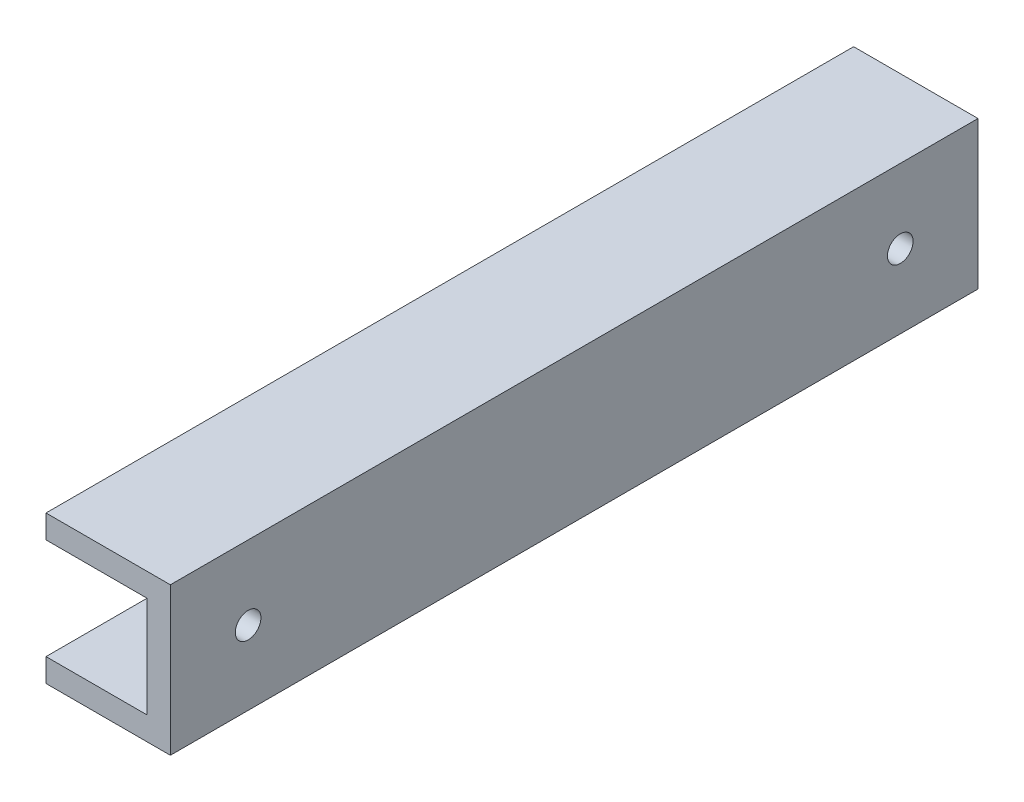
ISO-10303-21;
HEADER;
FILE_DESCRIPTION(('STEP AP214'),'2;1');
FILE_NAME('part.step','',(''),(''),'','','');
FILE_SCHEMA(('AUTOMOTIVE_DESIGN { 1 0 10303 214 1 1 1 1 }'));
ENDSEC;
DATA;
#1=APPLICATION_CONTEXT('core data for automotive mechanical design processes');
#2=APPLICATION_PROTOCOL_DEFINITION('international standard','automotive_design',2000,#1);
#3=PRODUCT_CONTEXT('',#1,'mechanical');
#4=PRODUCT('Part','Part','',(#3));
#5=PRODUCT_RELATED_PRODUCT_CATEGORY('part','',(#4));
#6=PRODUCT_DEFINITION_FORMATION('','',#4);
#7=PRODUCT_DEFINITION_CONTEXT('part definition',#1,'design');
#8=PRODUCT_DEFINITION('design','',#6,#7);
#9=PRODUCT_DEFINITION_SHAPE('','',#8);
#10=(LENGTH_UNIT() NAMED_UNIT(*) SI_UNIT(.MILLI.,.METRE.));
#11=(NAMED_UNIT(*) PLANE_ANGLE_UNIT() SI_UNIT($,.RADIAN.));
#12=(NAMED_UNIT(*) SI_UNIT($,.STERADIAN.) SOLID_ANGLE_UNIT());
#13=UNCERTAINTY_MEASURE_WITH_UNIT(LENGTH_MEASURE(1.E-05),#10,'distance_accuracy_value','');
#14=(GEOMETRIC_REPRESENTATION_CONTEXT(3) GLOBAL_UNCERTAINTY_ASSIGNED_CONTEXT((#13)) GLOBAL_UNIT_ASSIGNED_CONTEXT((#10,
#11,#12)) REPRESENTATION_CONTEXT('',''));
#15=CARTESIAN_POINT('',(0.,0.,0.));
#16=DIRECTION('',(0.,0.,1.));
#17=DIRECTION('',(1.,0.,0.));
#18=AXIS2_PLACEMENT_3D('',#15,#16,#17);
#19=CARTESIAN_POINT('',(3.,13.,23.));
#20=DIRECTION('',(0.,0.,1.));
#21=DIRECTION('',(0.,-1.,0.));
#22=AXIS2_PLACEMENT_3D('',#19,#20,#21);
#23=PLANE('',#22);
#24=DIRECTION('',(1.,0.,0.));
#25=VECTOR('',#24,1.);
#26=CARTESIAN_POINT('',(3.,13.,23.));
#27=LINE('',#26,#25);
#28=CARTESIAN_POINT('',(3.,13.,23.));
#29=VERTEX_POINT('',#28);
#30=CARTESIAN_POINT('',(8.99999999999998,13.,23.));
#31=VERTEX_POINT('',#30);
#32=EDGE_CURVE('E237',#29,#31,#27,.T.);
#33=ORIENTED_EDGE('',*,*,#32,.T.);
#34=DIRECTION('',(0.,-1.,0.));
#35=VECTOR('',#34,1.);
#36=CARTESIAN_POINT('',(8.99999999999998,13.,23.));
#37=LINE('',#36,#35);
#38=CARTESIAN_POINT('',(9.00000000000001,9.,23.));
#39=VERTEX_POINT('',#38);
#40=EDGE_CURVE('E71',#31,#39,#37,.T.);
#41=ORIENTED_EDGE('',*,*,#40,.T.);
#42=DIRECTION('',(-1.,0.,0.));
#43=VECTOR('',#42,1.);
#44=CARTESIAN_POINT('',(6.,9.,23.));
#45=LINE('',#44,#43);
#46=CARTESIAN_POINT('',(3.,9.,23.));
#47=VERTEX_POINT('',#46);
#48=EDGE_CURVE('E352',#39,#47,#45,.T.);
#49=ORIENTED_EDGE('',*,*,#48,.T.);
#50=DIRECTION('',(0.,-1.,0.));
#51=VECTOR('',#50,1.);
#52=CARTESIAN_POINT('',(3.,13.,23.));
#53=LINE('',#52,#51);
#54=EDGE_CURVE('E223',#29,#47,#53,.T.);
#55=ORIENTED_EDGE('',*,*,#54,.F.);
#56=EDGE_LOOP('',(#33,#41,#49,#55));
#57=FACE_BOUND('',#56,.T.);
#58=ADVANCED_FACE('F62',(#57),#23,.F.);
#59=CARTESIAN_POINT('',(3.,13.,80.9));
#60=DIRECTION('',(0.,0.,-1.));
#61=DIRECTION('',(-1.,0.,0.));
#62=AXIS2_PLACEMENT_3D('',#59,#60,#61);
#63=PLANE('',#62);
#64=DIRECTION('',(1.,0.,0.));
#65=VECTOR('',#64,1.);
#66=CARTESIAN_POINT('',(3.,0.,80.9));
#67=LINE('',#66,#65);
#68=CARTESIAN_POINT('',(3.,0.,80.9));
#69=VERTEX_POINT('',#68);
#70=CARTESIAN_POINT('',(8.99999999999996,0.,80.9));
#71=VERTEX_POINT('',#70);
#72=EDGE_CURVE('E224',#69,#71,#67,.T.);
#73=ORIENTED_EDGE('',*,*,#72,.T.);
#74=DIRECTION('',(0.,1.,0.));
#75=VECTOR('',#74,1.);
#76=CARTESIAN_POINT('',(8.99999999999996,13.,80.9));
#77=LINE('',#76,#75);
#78=CARTESIAN_POINT('',(8.99999999999999,4.,80.9));
#79=VERTEX_POINT('',#78);
#80=EDGE_CURVE('E334',#71,#79,#77,.T.);
#81=ORIENTED_EDGE('',*,*,#80,.T.);
#82=DIRECTION('',(-1.,0.,0.));
#83=VECTOR('',#82,1.);
#84=CARTESIAN_POINT('',(6.,4.,80.9));
#85=LINE('',#84,#83);
#86=CARTESIAN_POINT('',(3.,4.,80.9));
#87=VERTEX_POINT('',#86);
#88=EDGE_CURVE('E209',#79,#87,#85,.T.);
#89=ORIENTED_EDGE('',*,*,#88,.T.);
#90=DIRECTION('',(0.,1.,0.));
#91=VECTOR('',#90,1.);
#92=CARTESIAN_POINT('',(3.,13.,80.9));
#93=LINE('',#92,#91);
#94=EDGE_CURVE('E218',#69,#87,#93,.T.);
#95=ORIENTED_EDGE('',*,*,#94,.F.);
#96=EDGE_LOOP('',(#73,#81,#89,#95));
#97=FACE_BOUND('',#96,.T.);
#98=ADVANCED_FACE('F424',(#97),#63,.F.);
#99=CARTESIAN_POINT('',(3.,0.,0.));
#100=DIRECTION('',(-1.,0.,0.));
#101=DIRECTION('',(0.,0.,1.));
#102=AXIS2_PLACEMENT_3D('',#99,#100,#101);
#103=PLANE('',#102);
#104=DIRECTION('',(0.,0.,-1.));
#105=VECTOR('',#104,1.);
#106=CARTESIAN_POINT('',(3.,9.,23.));
#107=LINE('',#106,#105);
#108=CARTESIAN_POINT('',(3.,9.,80.9));
#109=VERTEX_POINT('',#108);
#110=EDGE_CURVE('E219',#109,#47,#107,.T.);
#111=ORIENTED_EDGE('',*,*,#110,.F.);
#112=CARTESIAN_POINT('',(3.,13.,80.9));
#113=VERTEX_POINT('',#112);
#114=EDGE_CURVE('E361',#109,#113,#93,.T.);
#115=ORIENTED_EDGE('',*,*,#114,.T.);
#116=DIRECTION('',(0.,0.,-1.));
#117=VECTOR('',#116,1.);
#118=CARTESIAN_POINT('',(3.,13.,23.));
#119=LINE('',#118,#117);
#120=EDGE_CURVE('E234',#113,#29,#119,.T.);
#121=ORIENTED_EDGE('',*,*,#120,.T.);
#122=ORIENTED_EDGE('',*,*,#54,.T.);
#123=EDGE_LOOP('',(#111,#115,#121,#122));
#124=FACE_BOUND('',#123,.T.);
#125=ADVANCED_FACE('F429',(#124),#103,.T.);
#126=CARTESIAN_POINT('',(0.,0.,103.9));
#127=DIRECTION('',(0.,1.,0.));
#128=DIRECTION('',(0.,0.,1.));
#129=AXIS2_PLACEMENT_3D('',#126,#127,#128);
#130=PLANE('',#129);
#131=DIRECTION('',(0.,0.,-1.));
#132=VECTOR('',#131,1.);
#133=CARTESIAN_POINT('',(13.,0.,103.9));
#134=LINE('',#133,#132);
#135=CARTESIAN_POINT('',(13.,0.,103.9));
#136=VERTEX_POINT('',#135);
#137=CARTESIAN_POINT('',(13.,0.,84.9));
#138=VERTEX_POINT('',#137);
#139=EDGE_CURVE('E285',#136,#138,#134,.T.);
#140=ORIENTED_EDGE('',*,*,#139,.T.);
#141=DIRECTION('',(-0.707106781186551,0.,-0.707106781186544));
#142=VECTOR('',#141,1.);
#143=CARTESIAN_POINT('',(15.9999999999999,0.,87.8999999999999));
#144=LINE('',#143,#142);
#145=EDGE_CURVE('E344',#138,#71,#144,.T.);
#146=ORIENTED_EDGE('',*,*,#145,.T.);
#147=ORIENTED_EDGE('',*,*,#72,.F.);
#148=DIRECTION('',(0.,0.,1.));
#149=VECTOR('',#148,1.);
#150=CARTESIAN_POINT('',(3.,0.,23.));
#151=LINE('',#150,#149);
#152=CARTESIAN_POINT('',(3.,0.,23.));
#153=VERTEX_POINT('',#152);
#154=EDGE_CURVE('E227',#153,#69,#151,.T.);
#155=ORIENTED_EDGE('',*,*,#154,.F.);
#156=DIRECTION('',(1.,0.,0.));
#157=VECTOR('',#156,1.);
#158=CARTESIAN_POINT('',(3.,0.,23.));
#159=LINE('',#158,#157);
#160=CARTESIAN_POINT('',(8.99999999999998,0.,23.));
#161=VERTEX_POINT('',#160);
#162=EDGE_CURVE('E222',#153,#161,#159,.T.);
#163=ORIENTED_EDGE('',*,*,#162,.T.);
#164=DIRECTION('',(0.707106781186552,0.,-0.707106781186543));
#165=VECTOR('',#164,1.);
#166=CARTESIAN_POINT('',(-35.9500000000001,0.,67.9499999999995));
#167=LINE('',#166,#165);
#168=CARTESIAN_POINT('',(13.,0.,19.));
#169=VERTEX_POINT('',#168);
#170=EDGE_CURVE('E78',#161,#169,#167,.T.);
#171=ORIENTED_EDGE('',*,*,#170,.T.);
#172=CARTESIAN_POINT('',(13.,0.,0.));
#173=VERTEX_POINT('',#172);
#174=EDGE_CURVE('E284',#169,#173,#134,.T.);
#175=ORIENTED_EDGE('',*,*,#174,.T.);
#176=DIRECTION('',(1.,0.,0.));
#177=VECTOR('',#176,1.);
#178=CARTESIAN_POINT('',(0.,0.,0.));
#179=LINE('',#178,#177);
#180=CARTESIAN_POINT('',(0.,0.,0.));
#181=VERTEX_POINT('',#180);
#182=EDGE_CURVE('E260',#181,#173,#179,.T.);
#183=ORIENTED_EDGE('',*,*,#182,.F.);
#184=DIRECTION('',(0.,0.,-1.));
#185=VECTOR('',#184,1.);
#186=CARTESIAN_POINT('',(0.,0.,103.9));
#187=LINE('',#186,#185);
#188=CARTESIAN_POINT('',(0.,0.,103.9));
#189=VERTEX_POINT('',#188);
#190=EDGE_CURVE('E288',#189,#181,#187,.T.);
#191=ORIENTED_EDGE('',*,*,#190,.F.);
#192=DIRECTION('',(1.,0.,0.));
#193=VECTOR('',#192,1.);
#194=CARTESIAN_POINT('',(0.,0.,103.9));
#195=LINE('',#194,#193);
#196=EDGE_CURVE('E261',#189,#136,#195,.T.);
#197=ORIENTED_EDGE('',*,*,#196,.T.);
#198=EDGE_LOOP('',(#140,#146,#147,#155,#163,#171,#175,#183,#191,#197));
#199=FACE_BOUND('',#198,.T.);
#200=ADVANCED_FACE('F397',(#199),#130,.T.);
#201=CARTESIAN_POINT('',(13.,0.,103.9));
#202=DIRECTION('',(-1.,0.,0.));
#203=DIRECTION('',(0.,0.,1.));
#204=AXIS2_PLACEMENT_3D('',#201,#202,#203);
#205=PLANE('',#204);
#206=CARTESIAN_POINT('',(13.,6.5,93.9));
#207=DIRECTION('',(-1.,0.,0.));
#208=DIRECTION('',(0.,0.,1.));
#209=AXIS2_PLACEMENT_3D('',#206,#207,#208);
#210=CIRCLE('',#209,1.65);
#211=CARTESIAN_POINT('',(13.,6.5,95.55));
#212=VERTEX_POINT('',#211);
#213=EDGE_CURVE('E248',#212,#212,#210,.T.);
#214=ORIENTED_EDGE('',*,*,#213,.F.);
#215=EDGE_LOOP('',(#214));
#216=FACE_BOUND('',#215,.T.);
#217=DIRECTION('',(0.,0.,-1.));
#218=VECTOR('',#217,1.);
#219=CARTESIAN_POINT('',(13.,13.,103.9));
#220=LINE('',#219,#218);
#221=CARTESIAN_POINT('',(13.,13.,103.9));
#222=VERTEX_POINT('',#221);
#223=CARTESIAN_POINT('',(13.,13.,84.9));
#224=VERTEX_POINT('',#223);
#225=EDGE_CURVE('E281',#222,#224,#220,.T.);
#226=ORIENTED_EDGE('',*,*,#225,.T.);
#227=DIRECTION('',(0.,-1.,0.));
#228=VECTOR('',#227,1.);
#229=CARTESIAN_POINT('',(13.,0.,84.9));
#230=LINE('',#229,#228);
#231=EDGE_CURVE('E341',#224,#138,#230,.T.);
#232=ORIENTED_EDGE('',*,*,#231,.T.);
#233=ORIENTED_EDGE('',*,*,#139,.F.);
#234=DIRECTION('',(0.,1.,0.));
#235=VECTOR('',#234,1.);
#236=CARTESIAN_POINT('',(13.,0.,103.9));
#237=LINE('',#236,#235);
#238=EDGE_CURVE('E263',#136,#222,#237,.T.);
#239=ORIENTED_EDGE('',*,*,#238,.T.);
#240=EDGE_LOOP('',(#226,#232,#233,#239));
#241=FACE_BOUND('',#240,.T.);
#242=ADVANCED_FACE('F395',(#216,#241),#205,.T.);
#243=CARTESIAN_POINT('',(0.,13.,103.9));
#244=DIRECTION('',(0.,-1.,0.));
#245=DIRECTION('',(0.,0.,-1.));
#246=AXIS2_PLACEMENT_3D('',#243,#244,#245);
#247=PLANE('',#246);
#248=DIRECTION('',(1.,0.,0.));
#249=VECTOR('',#248,1.);
#250=CARTESIAN_POINT('',(3.,13.,80.9));
#251=LINE('',#250,#249);
#252=CARTESIAN_POINT('',(8.99999999999996,13.,80.9));
#253=VERTEX_POINT('',#252);
#254=EDGE_CURVE('E229',#113,#253,#251,.T.);
#255=ORIENTED_EDGE('',*,*,#254,.T.);
#256=DIRECTION('',(0.707106781186551,0.,0.707106781186544));
#257=VECTOR('',#256,1.);
#258=CARTESIAN_POINT('',(15.9999999999999,13.,87.8999999999999));
#259=LINE('',#258,#257);
#260=EDGE_CURVE('E339',#253,#224,#259,.T.);
#261=ORIENTED_EDGE('',*,*,#260,.T.);
#262=ORIENTED_EDGE('',*,*,#225,.F.);
#263=DIRECTION('',(-1.,0.,0.));
#264=VECTOR('',#263,1.);
#265=CARTESIAN_POINT('',(0.,13.,103.9));
#266=LINE('',#265,#264);
#267=CARTESIAN_POINT('',(0.,13.,103.9));
#268=VERTEX_POINT('',#267);
#269=EDGE_CURVE('E267',#222,#268,#266,.T.);
#270=ORIENTED_EDGE('',*,*,#269,.T.);
#271=DIRECTION('',(0.,0.,-1.));
#272=VECTOR('',#271,1.);
#273=CARTESIAN_POINT('',(0.,13.,103.9));
#274=LINE('',#273,#272);
#275=CARTESIAN_POINT('',(0.,13.,0.));
#276=VERTEX_POINT('',#275);
#277=EDGE_CURVE('E270',#268,#276,#274,.T.);
#278=ORIENTED_EDGE('',*,*,#277,.T.);
#279=DIRECTION('',(-1.,0.,0.));
#280=VECTOR('',#279,1.);
#281=CARTESIAN_POINT('',(0.,13.,0.));
#282=LINE('',#281,#280);
#283=CARTESIAN_POINT('',(13.,13.,0.));
#284=VERTEX_POINT('',#283);
#285=EDGE_CURVE('E264',#284,#276,#282,.T.);
#286=ORIENTED_EDGE('',*,*,#285,.F.);
#287=CARTESIAN_POINT('',(13.,13.,19.));
#288=VERTEX_POINT('',#287);
#289=EDGE_CURVE('E280',#288,#284,#220,.T.);
#290=ORIENTED_EDGE('',*,*,#289,.F.);
#291=DIRECTION('',(-0.707106781186552,0.,0.707106781186543));
#292=VECTOR('',#291,1.);
#293=CARTESIAN_POINT('',(-35.9500000000001,13.,67.9499999999995));
#294=LINE('',#293,#292);
#295=EDGE_CURVE('E337',#288,#31,#294,.T.);
#296=ORIENTED_EDGE('',*,*,#295,.T.);
#297=ORIENTED_EDGE('',*,*,#32,.F.);
#298=ORIENTED_EDGE('',*,*,#120,.F.);
#299=EDGE_LOOP('',(#255,#261,#262,#270,#278,#286,#290,#296,#297,#298));
#300=FACE_BOUND('',#299,.T.);
#301=ADVANCED_FACE('F384',(#300),#247,.T.);
#302=CARTESIAN_POINT('',(13.,6.5,10.));
#303=DIRECTION('',(-1.,0.,0.));
#304=DIRECTION('',(0.,0.,1.));
#305=AXIS2_PLACEMENT_3D('',#302,#303,#304);
#306=CIRCLE('',#305,1.65);
#307=CARTESIAN_POINT('',(13.,6.5,11.65));
#308=VERTEX_POINT('',#307);
#309=EDGE_CURVE('E256',#308,#308,#306,.T.);
#310=ORIENTED_EDGE('',*,*,#309,.F.);
#311=EDGE_LOOP('',(#310));
#312=FACE_BOUND('',#311,.T.);
#313=ORIENTED_EDGE('',*,*,#174,.F.);
#314=DIRECTION('',(0.,1.,0.));
#315=VECTOR('',#314,1.);
#316=CARTESIAN_POINT('',(13.,0.,19.));
#317=LINE('',#316,#315);
#318=EDGE_CURVE('E12',#169,#288,#317,.T.);
#319=ORIENTED_EDGE('',*,*,#318,.T.);
#320=ORIENTED_EDGE('',*,*,#289,.T.);
#321=DIRECTION('',(0.,1.,0.));
#322=VECTOR('',#321,1.);
#323=CARTESIAN_POINT('',(13.,0.,0.));
#324=LINE('',#323,#322);
#325=EDGE_CURVE('E273',#173,#284,#324,.T.);
#326=ORIENTED_EDGE('',*,*,#325,.F.);
#327=EDGE_LOOP('',(#313,#319,#320,#326));
#328=FACE_BOUND('',#327,.T.);
#329=ADVANCED_FACE('F417',(#312,#328),#205,.T.);
#330=CARTESIAN_POINT('',(0.,0.,103.9));
#331=DIRECTION('',(0.,0.,1.));
#332=DIRECTION('',(1.,0.,0.));
#333=AXIS2_PLACEMENT_3D('',#330,#331,#332);
#334=PLANE('',#333);
#335=DIRECTION('',(-1.,0.,0.));
#336=VECTOR('',#335,1.);
#337=CARTESIAN_POINT('',(0.,16.,103.9));
#338=LINE('',#337,#336);
#339=CARTESIAN_POINT('',(16.,16.,103.9));
#340=VERTEX_POINT('',#339);
#341=CARTESIAN_POINT('',(0.,16.,103.9));
#342=VERTEX_POINT('',#341);
#343=EDGE_CURVE('E296',#340,#342,#338,.T.);
#344=ORIENTED_EDGE('',*,*,#343,.T.);
#345=DIRECTION('',(0.,-1.,0.));
#346=VECTOR('',#345,1.);
#347=CARTESIAN_POINT('',(0.,0.,103.9));
#348=LINE('',#347,#346);
#349=EDGE_CURVE('E244',#342,#268,#348,.T.);
#350=ORIENTED_EDGE('',*,*,#349,.T.);
#351=ORIENTED_EDGE('',*,*,#269,.F.);
#352=ORIENTED_EDGE('',*,*,#238,.F.);
#353=ORIENTED_EDGE('',*,*,#196,.F.);
#354=CARTESIAN_POINT('',(0.,-3.,103.9));
#355=VERTEX_POINT('',#354);
#356=EDGE_CURVE('E249',#189,#355,#348,.T.);
#357=ORIENTED_EDGE('',*,*,#356,.T.);
#358=DIRECTION('',(1.,0.,0.));
#359=VECTOR('',#358,1.);
#360=CARTESIAN_POINT('',(0.,-3.,103.9));
#361=LINE('',#360,#359);
#362=CARTESIAN_POINT('',(16.,-3.,103.9));
#363=VERTEX_POINT('',#362);
#364=EDGE_CURVE('E291',#355,#363,#361,.T.);
#365=ORIENTED_EDGE('',*,*,#364,.T.);
#366=DIRECTION('',(0.,1.,0.));
#367=VECTOR('',#366,1.);
#368=CARTESIAN_POINT('',(16.,0.,103.9));
#369=LINE('',#368,#367);
#370=EDGE_CURVE('E293',#363,#340,#369,.T.);
#371=ORIENTED_EDGE('',*,*,#370,.T.);
#372=EDGE_LOOP('',(#344,#350,#351,#352,#353,#357,#365,#371));
#373=FACE_BOUND('',#372,.T.);
#374=ADVANCED_FACE('F404',(#373),#334,.T.);
#375=CARTESIAN_POINT('',(0.,0.,0.));
#376=DIRECTION('',(0.,0.,1.));
#377=DIRECTION('',(1.,0.,0.));
#378=AXIS2_PLACEMENT_3D('',#375,#376,#377);
#379=PLANE('',#378);
#380=DIRECTION('',(0.,-1.,0.));
#381=VECTOR('',#380,1.);
#382=CARTESIAN_POINT('',(0.,0.,0.));
#383=LINE('',#382,#381);
#384=CARTESIAN_POINT('',(0.,16.,0.));
#385=VERTEX_POINT('',#384);
#386=EDGE_CURVE('E242',#385,#276,#383,.T.);
#387=ORIENTED_EDGE('',*,*,#386,.F.);
#388=DIRECTION('',(-1.,0.,0.));
#389=VECTOR('',#388,1.);
#390=CARTESIAN_POINT('',(0.,16.,0.));
#391=LINE('',#390,#389);
#392=CARTESIAN_POINT('',(16.,16.,0.));
#393=VERTEX_POINT('',#392);
#394=EDGE_CURVE('E294',#393,#385,#391,.T.);
#395=ORIENTED_EDGE('',*,*,#394,.F.);
#396=DIRECTION('',(0.,1.,0.));
#397=VECTOR('',#396,1.);
#398=CARTESIAN_POINT('',(16.,0.,0.));
#399=LINE('',#398,#397);
#400=CARTESIAN_POINT('',(16.,-3.,0.));
#401=VERTEX_POINT('',#400);
#402=EDGE_CURVE('E301',#401,#393,#399,.T.);
#403=ORIENTED_EDGE('',*,*,#402,.F.);
#404=DIRECTION('',(1.,0.,0.));
#405=VECTOR('',#404,1.);
#406=CARTESIAN_POINT('',(0.,-3.,0.));
#407=LINE('',#406,#405);
#408=CARTESIAN_POINT('',(0.,-3.,0.));
#409=VERTEX_POINT('',#408);
#410=EDGE_CURVE('E290',#409,#401,#407,.T.);
#411=ORIENTED_EDGE('',*,*,#410,.F.);
#412=EDGE_CURVE('E241',#181,#409,#383,.T.);
#413=ORIENTED_EDGE('',*,*,#412,.F.);
#414=ORIENTED_EDGE('',*,*,#182,.T.);
#415=ORIENTED_EDGE('',*,*,#325,.T.);
#416=ORIENTED_EDGE('',*,*,#285,.T.);
#417=EDGE_LOOP('',(#387,#395,#403,#411,#413,#414,#415,#416));
#418=FACE_BOUND('',#417,.T.);
#419=ADVANCED_FACE('F412',(#418),#379,.F.);
#420=CARTESIAN_POINT('',(0.,-3.,103.9));
#421=DIRECTION('',(0.,1.,0.));
#422=DIRECTION('',(0.,0.,1.));
#423=AXIS2_PLACEMENT_3D('',#420,#421,#422);
#424=PLANE('',#423);
#425=DIRECTION('',(0.,0.,1.));
#426=VECTOR('',#425,1.);
#427=CARTESIAN_POINT('',(0.,-3.,103.9));
#428=LINE('',#427,#426);
#429=EDGE_CURVE('E250',#409,#355,#428,.T.);
#430=ORIENTED_EDGE('',*,*,#429,.F.);
#431=ORIENTED_EDGE('',*,*,#410,.T.);
#432=DIRECTION('',(0.,0.,-1.));
#433=VECTOR('',#432,1.);
#434=CARTESIAN_POINT('',(16.,-3.,103.9));
#435=LINE('',#434,#433);
#436=EDGE_CURVE('E307',#363,#401,#435,.T.);
#437=ORIENTED_EDGE('',*,*,#436,.F.);
#438=ORIENTED_EDGE('',*,*,#364,.F.);
#439=EDGE_LOOP('',(#430,#431,#437,#438));
#440=FACE_BOUND('',#439,.T.);
#441=ADVANCED_FACE('F467',(#440),#424,.F.);
#442=CARTESIAN_POINT('',(0.,16.,103.9));
#443=DIRECTION('',(0.,-1.,0.));
#444=DIRECTION('',(0.,0.,-1.));
#445=AXIS2_PLACEMENT_3D('',#442,#443,#444);
#446=PLANE('',#445);
#447=DIRECTION('',(0.,0.,-1.));
#448=VECTOR('',#447,1.);
#449=CARTESIAN_POINT('',(0.,16.,103.9));
#450=LINE('',#449,#448);
#451=EDGE_CURVE('E245',#342,#385,#450,.T.);
#452=ORIENTED_EDGE('',*,*,#451,.F.);
#453=ORIENTED_EDGE('',*,*,#343,.F.);
#454=DIRECTION('',(0.,0.,-1.));
#455=VECTOR('',#454,1.);
#456=CARTESIAN_POINT('',(16.,16.,103.9));
#457=LINE('',#456,#455);
#458=EDGE_CURVE('E299',#340,#393,#457,.T.);
#459=ORIENTED_EDGE('',*,*,#458,.T.);
#460=ORIENTED_EDGE('',*,*,#394,.T.);
#461=EDGE_LOOP('',(#452,#453,#459,#460));
#462=FACE_BOUND('',#461,.T.);
#463=ADVANCED_FACE('F468',(#462),#446,.F.);
#464=CARTESIAN_POINT('',(16.,0.,103.9));
#465=DIRECTION('',(-1.,0.,0.));
#466=DIRECTION('',(0.,0.,1.));
#467=AXIS2_PLACEMENT_3D('',#464,#465,#466);
#468=PLANE('',#467);
#469=CARTESIAN_POINT('',(16.,6.5,10.));
#470=DIRECTION('',(-1.,0.,0.));
#471=DIRECTION('',(0.,0.,1.));
#472=AXIS2_PLACEMENT_3D('',#469,#470,#471);
#473=CIRCLE('',#472,1.65);
#474=CARTESIAN_POINT('',(16.,6.5,11.65));
#475=VERTEX_POINT('',#474);
#476=EDGE_CURVE('E257',#475,#475,#473,.T.);
#477=ORIENTED_EDGE('',*,*,#476,.T.);
#478=EDGE_LOOP('',(#477));
#479=FACE_BOUND('',#478,.T.);
#480=CARTESIAN_POINT('',(16.,6.5,93.9));
#481=DIRECTION('',(-1.,0.,0.));
#482=DIRECTION('',(0.,0.,1.));
#483=AXIS2_PLACEMENT_3D('',#480,#481,#482);
#484=CIRCLE('',#483,1.65);
#485=CARTESIAN_POINT('',(16.,6.5,95.55));
#486=VERTEX_POINT('',#485);
#487=EDGE_CURVE('E253',#486,#486,#484,.T.);
#488=ORIENTED_EDGE('',*,*,#487,.T.);
#489=EDGE_LOOP('',(#488));
#490=FACE_BOUND('',#489,.T.);
#491=ORIENTED_EDGE('',*,*,#402,.T.);
#492=ORIENTED_EDGE('',*,*,#458,.F.);
#493=ORIENTED_EDGE('',*,*,#370,.F.);
#494=ORIENTED_EDGE('',*,*,#436,.T.);
#495=EDGE_LOOP('',(#491,#492,#493,#494));
#496=FACE_BOUND('',#495,.T.);
#497=ADVANCED_FACE('F454',(#479,#490,#496),#468,.F.);
#498=CARTESIAN_POINT('',(27.,6.5,93.9));
#499=DIRECTION('',(-1.,0.,0.));
#500=DIRECTION('',(0.,0.,1.));
#501=AXIS2_PLACEMENT_3D('',#498,#499,#500);
#502=CYLINDRICAL_SURFACE('',#501,1.65);
#503=CARTESIAN_POINT('',(13.,6.5,95.55));
#504=CARTESIAN_POINT('',(13.03125,6.5,95.55));
#505=CARTESIAN_POINT('',(13.0625,6.5,95.55));
#506=CARTESIAN_POINT('',(13.125,6.5,95.55));
#507=CARTESIAN_POINT('',(13.15625,6.5,95.55));
#508=CARTESIAN_POINT('',(13.21875,6.5,95.55));
#509=CARTESIAN_POINT('',(13.25,6.5,95.55));
#510=CARTESIAN_POINT('',(13.3125,6.5,95.55));
#511=CARTESIAN_POINT('',(13.34375,6.5,95.55));
#512=CARTESIAN_POINT('',(13.40625,6.5,95.55));
#513=CARTESIAN_POINT('',(13.4375,6.5,95.55));
#514=CARTESIAN_POINT('',(13.5,6.5,95.55));
#515=CARTESIAN_POINT('',(13.53125,6.5,95.55));
#516=CARTESIAN_POINT('',(13.59375,6.5,95.55));
#517=CARTESIAN_POINT('',(13.625,6.5,95.55));
#518=CARTESIAN_POINT('',(13.6875,6.5,95.55));
#519=CARTESIAN_POINT('',(13.71875,6.5,95.55));
#520=CARTESIAN_POINT('',(13.78125,6.5,95.55));
#521=CARTESIAN_POINT('',(13.8125,6.5,95.55));
#522=CARTESIAN_POINT('',(13.875,6.5,95.55));
#523=CARTESIAN_POINT('',(13.90625,6.5,95.55));
#524=CARTESIAN_POINT('',(13.96875,6.5,95.55));
#525=CARTESIAN_POINT('',(14.,6.5,95.55));
#526=CARTESIAN_POINT('',(14.0625,6.5,95.55));
#527=CARTESIAN_POINT('',(14.09375,6.5,95.55));
#528=CARTESIAN_POINT('',(14.15625,6.5,95.55));
#529=CARTESIAN_POINT('',(14.1875,6.5,95.55));
#530=CARTESIAN_POINT('',(14.25,6.5,95.55));
#531=CARTESIAN_POINT('',(14.28125,6.5,95.55));
#532=CARTESIAN_POINT('',(14.34375,6.5,95.55));
#533=CARTESIAN_POINT('',(14.375,6.5,95.55));
#534=CARTESIAN_POINT('',(14.4375,6.5,95.55));
#535=CARTESIAN_POINT('',(14.46875,6.5,95.55));
#536=CARTESIAN_POINT('',(14.53125,6.5,95.55));
#537=CARTESIAN_POINT('',(14.5625,6.5,95.55));
#538=CARTESIAN_POINT('',(14.625,6.5,95.55));
#539=CARTESIAN_POINT('',(14.65625,6.5,95.55));
#540=CARTESIAN_POINT('',(14.71875,6.5,95.55));
#541=CARTESIAN_POINT('',(14.75,6.5,95.55));
#542=CARTESIAN_POINT('',(14.8125,6.5,95.55));
#543=CARTESIAN_POINT('',(14.84375,6.5,95.55));
#544=CARTESIAN_POINT('',(14.90625,6.5,95.55));
#545=CARTESIAN_POINT('',(14.9375,6.5,95.55));
#546=CARTESIAN_POINT('',(15.,6.5,95.55));
#547=CARTESIAN_POINT('',(15.03125,6.5,95.55));
#548=CARTESIAN_POINT('',(15.09375,6.5,95.55));
#549=CARTESIAN_POINT('',(15.125,6.5,95.55));
#550=CARTESIAN_POINT('',(15.1875,6.5,95.55));
#551=CARTESIAN_POINT('',(15.21875,6.5,95.55));
#552=CARTESIAN_POINT('',(15.28125,6.5,95.55));
#553=CARTESIAN_POINT('',(15.3125,6.5,95.55));
#554=CARTESIAN_POINT('',(15.375,6.5,95.55));
#555=CARTESIAN_POINT('',(15.40625,6.5,95.55));
#556=CARTESIAN_POINT('',(15.46875,6.5,95.55));
#557=CARTESIAN_POINT('',(15.5,6.5,95.55));
#558=CARTESIAN_POINT('',(15.5625,6.5,95.55));
#559=CARTESIAN_POINT('',(15.59375,6.5,95.55));
#560=CARTESIAN_POINT('',(15.65625,6.5,95.55));
#561=CARTESIAN_POINT('',(15.6875,6.5,95.55));
#562=CARTESIAN_POINT('',(15.75,6.5,95.55));
#563=CARTESIAN_POINT('',(15.78125,6.5,95.55));
#564=CARTESIAN_POINT('',(15.84375,6.5,95.55));
#565=CARTESIAN_POINT('',(15.875,6.5,95.55));
#566=CARTESIAN_POINT('',(15.9375,6.5,95.55));
#567=CARTESIAN_POINT('',(15.96875,6.5,95.55));
#568=CARTESIAN_POINT('',(16.,6.5,95.55));
#569=B_SPLINE_CURVE_WITH_KNOTS('',3,(#503,#504,#505,#506,#507,#508,#509,#510,#511,#512,#513,
#514,#515,#516,#517,#518,#519,#520,#521,#522,#523,#524,#525,#526,#527,#528,#529,#530,#531,#532,
#533,#534,#535,#536,#537,#538,#539,#540,#541,#542,#543,#544,#545,#546,#547,#548,#549,#550,#551,
#552,#553,#554,#555,#556,#557,#558,#559,#560,#561,#562,#563,#564,#565,#566,#567,#568),
.UNSPECIFIED.,.F.,.F.,(4,2,2,2,2,2,2,2,2,2,2,2,2,2,2,2,2,2,2,2,2,2,2,2,2,2,2,2,2,2,2,2,4),(0.,
0.0937500000000001,0.1875,0.28125,0.375,0.46875,0.5625,0.656250000000001,0.750000000000001,
0.843749999999999,0.937499999999999,1.03125,1.125,1.21875,1.3125,1.40625,1.5,1.59375,1.6875,
1.78125,1.875,1.96875,2.0625,2.15625,2.25,2.34375,2.4375,2.53125,2.625,2.71875,2.8125,2.90625,
3.),.UNSPECIFIED.);
#570=EDGE_CURVE('BSEAM450',#212,#486,#569,.T.);
#571=ORIENTED_EDGE('',*,*,#213,.T.);
#572=ORIENTED_EDGE('',*,*,#487,.F.);
#573=ORIENTED_EDGE('',*,*,#570,.T.);
#574=ORIENTED_EDGE('',*,*,#570,.F.);
#575=EDGE_LOOP('',(#571,#573,#572,#574));
#576=FACE_BOUND('',#575,.T.);
#577=ADVANCED_FACE('F450',(#576),#502,.F.);
#578=CARTESIAN_POINT('',(27.,6.5,10.));
#579=DIRECTION('',(-1.,0.,0.));
#580=DIRECTION('',(0.,0.,1.));
#581=AXIS2_PLACEMENT_3D('',#578,#579,#580);
#582=CYLINDRICAL_SURFACE('',#581,1.65);
#583=CARTESIAN_POINT('',(13.,6.5,11.65));
#584=CARTESIAN_POINT('',(13.03125,6.5,11.65));
#585=CARTESIAN_POINT('',(13.0625,6.5,11.65));
#586=CARTESIAN_POINT('',(13.125,6.5,11.65));
#587=CARTESIAN_POINT('',(13.15625,6.5,11.65));
#588=CARTESIAN_POINT('',(13.21875,6.5,11.65));
#589=CARTESIAN_POINT('',(13.25,6.5,11.65));
#590=CARTESIAN_POINT('',(13.3125,6.5,11.65));
#591=CARTESIAN_POINT('',(13.34375,6.5,11.65));
#592=CARTESIAN_POINT('',(13.40625,6.5,11.65));
#593=CARTESIAN_POINT('',(13.4375,6.5,11.65));
#594=CARTESIAN_POINT('',(13.5,6.5,11.65));
#595=CARTESIAN_POINT('',(13.53125,6.5,11.65));
#596=CARTESIAN_POINT('',(13.59375,6.5,11.65));
#597=CARTESIAN_POINT('',(13.625,6.5,11.65));
#598=CARTESIAN_POINT('',(13.6875,6.5,11.65));
#599=CARTESIAN_POINT('',(13.71875,6.5,11.65));
#600=CARTESIAN_POINT('',(13.78125,6.5,11.65));
#601=CARTESIAN_POINT('',(13.8125,6.5,11.65));
#602=CARTESIAN_POINT('',(13.875,6.5,11.65));
#603=CARTESIAN_POINT('',(13.90625,6.5,11.65));
#604=CARTESIAN_POINT('',(13.96875,6.5,11.65));
#605=CARTESIAN_POINT('',(14.,6.5,11.65));
#606=CARTESIAN_POINT('',(14.0625,6.5,11.65));
#607=CARTESIAN_POINT('',(14.09375,6.5,11.65));
#608=CARTESIAN_POINT('',(14.15625,6.5,11.65));
#609=CARTESIAN_POINT('',(14.1875,6.5,11.65));
#610=CARTESIAN_POINT('',(14.25,6.5,11.65));
#611=CARTESIAN_POINT('',(14.28125,6.5,11.65));
#612=CARTESIAN_POINT('',(14.34375,6.5,11.65));
#613=CARTESIAN_POINT('',(14.375,6.5,11.65));
#614=CARTESIAN_POINT('',(14.4375,6.5,11.65));
#615=CARTESIAN_POINT('',(14.46875,6.5,11.65));
#616=CARTESIAN_POINT('',(14.53125,6.5,11.65));
#617=CARTESIAN_POINT('',(14.5625,6.5,11.65));
#618=CARTESIAN_POINT('',(14.625,6.5,11.65));
#619=CARTESIAN_POINT('',(14.65625,6.5,11.65));
#620=CARTESIAN_POINT('',(14.71875,6.5,11.65));
#621=CARTESIAN_POINT('',(14.75,6.5,11.65));
#622=CARTESIAN_POINT('',(14.8125,6.5,11.65));
#623=CARTESIAN_POINT('',(14.84375,6.5,11.65));
#624=CARTESIAN_POINT('',(14.90625,6.5,11.65));
#625=CARTESIAN_POINT('',(14.9375,6.5,11.65));
#626=CARTESIAN_POINT('',(15.,6.5,11.65));
#627=CARTESIAN_POINT('',(15.03125,6.5,11.65));
#628=CARTESIAN_POINT('',(15.09375,6.5,11.65));
#629=CARTESIAN_POINT('',(15.125,6.5,11.65));
#630=CARTESIAN_POINT('',(15.1875,6.5,11.65));
#631=CARTESIAN_POINT('',(15.21875,6.5,11.65));
#632=CARTESIAN_POINT('',(15.28125,6.5,11.65));
#633=CARTESIAN_POINT('',(15.3125,6.5,11.65));
#634=CARTESIAN_POINT('',(15.375,6.5,11.65));
#635=CARTESIAN_POINT('',(15.40625,6.5,11.65));
#636=CARTESIAN_POINT('',(15.46875,6.5,11.65));
#637=CARTESIAN_POINT('',(15.5,6.5,11.65));
#638=CARTESIAN_POINT('',(15.5625,6.5,11.65));
#639=CARTESIAN_POINT('',(15.59375,6.5,11.65));
#640=CARTESIAN_POINT('',(15.65625,6.5,11.65));
#641=CARTESIAN_POINT('',(15.6875,6.5,11.65));
#642=CARTESIAN_POINT('',(15.75,6.5,11.65));
#643=CARTESIAN_POINT('',(15.78125,6.5,11.65));
#644=CARTESIAN_POINT('',(15.84375,6.5,11.65));
#645=CARTESIAN_POINT('',(15.875,6.5,11.65));
#646=CARTESIAN_POINT('',(15.9375,6.5,11.65));
#647=CARTESIAN_POINT('',(15.96875,6.5,11.65));
#648=CARTESIAN_POINT('',(16.,6.5,11.65));
#649=B_SPLINE_CURVE_WITH_KNOTS('',3,(#583,#584,#585,#586,#587,#588,#589,#590,#591,#592,#593,
#594,#595,#596,#597,#598,#599,#600,#601,#602,#603,#604,#605,#606,#607,#608,#609,#610,#611,#612,
#613,#614,#615,#616,#617,#618,#619,#620,#621,#622,#623,#624,#625,#626,#627,#628,#629,#630,#631,
#632,#633,#634,#635,#636,#637,#638,#639,#640,#641,#642,#643,#644,#645,#646,#647,#648),
.UNSPECIFIED.,.F.,.F.,(4,2,2,2,2,2,2,2,2,2,2,2,2,2,2,2,2,2,2,2,2,2,2,2,2,2,2,2,2,2,2,2,4),(0.,
0.0937500000000001,0.1875,0.28125,0.375,0.46875,0.5625,0.656250000000001,0.750000000000001,
0.843749999999999,0.937499999999999,1.03125,1.125,1.21875,1.3125,1.40625,1.5,1.59375,1.6875,
1.78125,1.875,1.96875,2.0625,2.15625,2.25,2.34375,2.4375,2.53125,2.625,2.71875,2.8125,2.90625,
3.),.UNSPECIFIED.);
#650=EDGE_CURVE('BSEAM446',#308,#475,#649,.T.);
#651=ORIENTED_EDGE('',*,*,#309,.T.);
#652=ORIENTED_EDGE('',*,*,#476,.F.);
#653=ORIENTED_EDGE('',*,*,#650,.T.);
#654=ORIENTED_EDGE('',*,*,#650,.F.);
#655=EDGE_LOOP('',(#651,#653,#652,#654));
#656=FACE_BOUND('',#655,.T.);
#657=ADVANCED_FACE('F446',(#656),#582,.F.);
#658=CARTESIAN_POINT('',(0.,0.,0.));
#659=DIRECTION('',(-1.,0.,0.));
#660=DIRECTION('',(0.,0.,1.));
#661=AXIS2_PLACEMENT_3D('',#658,#659,#660);
#662=PLANE('',#661);
#663=ORIENTED_EDGE('',*,*,#451,.T.);
#664=ORIENTED_EDGE('',*,*,#386,.T.);
#665=ORIENTED_EDGE('',*,*,#277,.F.);
#666=ORIENTED_EDGE('',*,*,#349,.F.);
#667=EDGE_LOOP('',(#663,#664,#665,#666));
#668=FACE_BOUND('',#667,.T.);
#669=ADVANCED_FACE('F441',(#668),#662,.T.);
#670=ORIENTED_EDGE('',*,*,#429,.T.);
#671=ORIENTED_EDGE('',*,*,#356,.F.);
#672=ORIENTED_EDGE('',*,*,#190,.T.);
#673=ORIENTED_EDGE('',*,*,#412,.T.);
#674=EDGE_LOOP('',(#670,#671,#672,#673));
#675=FACE_BOUND('',#674,.T.);
#676=ADVANCED_FACE('F436',(#675),#662,.T.);
#677=DIRECTION('',(-1.,0.,0.));
#678=VECTOR('',#677,1.);
#679=CARTESIAN_POINT('',(6.,4.,23.));
#680=LINE('',#679,#678);
#681=CARTESIAN_POINT('',(9.00000000000001,4.,23.));
#682=VERTEX_POINT('',#681);
#683=CARTESIAN_POINT('',(3.,4.,23.));
#684=VERTEX_POINT('',#683);
#685=EDGE_CURVE('E199',#682,#684,#680,.T.);
#686=ORIENTED_EDGE('',*,*,#685,.F.);
#687=DIRECTION('',(0.,-1.,0.));
#688=VECTOR('',#687,1.);
#689=CARTESIAN_POINT('',(8.99999999999998,13.,23.));
#690=LINE('',#689,#688);
#691=EDGE_CURVE('E86',#682,#161,#690,.T.);
#692=ORIENTED_EDGE('',*,*,#691,.T.);
#693=ORIENTED_EDGE('',*,*,#162,.F.);
#694=EDGE_CURVE('E215',#684,#153,#53,.T.);
#695=ORIENTED_EDGE('',*,*,#694,.F.);
#696=EDGE_LOOP('',(#686,#692,#693,#695));
#697=FACE_BOUND('',#696,.T.);
#698=ADVANCED_FACE('F221',(#697),#23,.F.);
#699=DIRECTION('',(0.,0.,1.));
#700=VECTOR('',#699,1.);
#701=CARTESIAN_POINT('',(3.,4.,23.));
#702=LINE('',#701,#700);
#703=EDGE_CURVE('E203',#684,#87,#702,.T.);
#704=ORIENTED_EDGE('',*,*,#703,.F.);
#705=ORIENTED_EDGE('',*,*,#694,.T.);
#706=ORIENTED_EDGE('',*,*,#154,.T.);
#707=ORIENTED_EDGE('',*,*,#94,.T.);
#708=EDGE_LOOP('',(#704,#705,#706,#707));
#709=FACE_BOUND('',#708,.T.);
#710=ADVANCED_FACE('F214',(#709),#103,.T.);
#711=DIRECTION('',(-1.,0.,0.));
#712=VECTOR('',#711,1.);
#713=CARTESIAN_POINT('',(6.,9.,80.9));
#714=LINE('',#713,#712);
#715=CARTESIAN_POINT('',(8.99999999999999,9.,80.9));
#716=VERTEX_POINT('',#715);
#717=EDGE_CURVE('E362',#716,#109,#714,.T.);
#718=ORIENTED_EDGE('',*,*,#717,.F.);
#719=DIRECTION('',(0.,1.,0.));
#720=VECTOR('',#719,1.);
#721=CARTESIAN_POINT('',(8.99999999999996,13.,80.9));
#722=LINE('',#721,#720);
#723=EDGE_CURVE('E332',#716,#253,#722,.T.);
#724=ORIENTED_EDGE('',*,*,#723,.T.);
#725=ORIENTED_EDGE('',*,*,#254,.F.);
#726=ORIENTED_EDGE('',*,*,#114,.F.);
#727=EDGE_LOOP('',(#718,#724,#725,#726));
#728=FACE_BOUND('',#727,.T.);
#729=ADVANCED_FACE('F432',(#728),#63,.F.);
#730=CARTESIAN_POINT('',(6.,9.,23.));
#731=DIRECTION('',(0.,1.,0.));
#732=DIRECTION('',(0.,0.,1.));
#733=AXIS2_PLACEMENT_3D('',#730,#731,#732);
#734=PLANE('',#733);
#735=ORIENTED_EDGE('',*,*,#110,.T.);
#736=ORIENTED_EDGE('',*,*,#48,.F.);
#737=DIRECTION('',(-0.707106781186548,0.,0.707106781186547));
#738=VECTOR('',#737,1.);
#739=CARTESIAN_POINT('',(7.5,9.,24.5));
#740=LINE('',#739,#738);
#741=CARTESIAN_POINT('',(6.,9.,26.));
#742=VERTEX_POINT('',#741);
#743=EDGE_CURVE('E330',#39,#742,#740,.T.);
#744=ORIENTED_EDGE('',*,*,#743,.T.);
#745=DIRECTION('',(0.,0.,-1.));
#746=VECTOR('',#745,1.);
#747=CARTESIAN_POINT('',(6.,9.,23.));
#748=LINE('',#747,#746);
#749=CARTESIAN_POINT('',(6.,9.,77.9));
#750=VERTEX_POINT('',#749);
#751=EDGE_CURVE('E210',#750,#742,#748,.T.);
#752=ORIENTED_EDGE('',*,*,#751,.F.);
#753=DIRECTION('',(0.707106781186549,0.,0.707106781186546));
#754=VECTOR('',#753,1.);
#755=CARTESIAN_POINT('',(-21.45,9.,50.4500000000001));
#756=LINE('',#755,#754);
#757=EDGE_CURVE('E324',#750,#716,#756,.T.);
#758=ORIENTED_EDGE('',*,*,#757,.T.);
#759=ORIENTED_EDGE('',*,*,#717,.T.);
#760=EDGE_LOOP('',(#735,#736,#744,#752,#758,#759));
#761=FACE_BOUND('',#760,.T.);
#762=ADVANCED_FACE('F357',(#761),#734,.F.);
#763=CARTESIAN_POINT('',(6.,4.,23.));
#764=DIRECTION('',(0.,-1.,0.));
#765=DIRECTION('',(0.,0.,-1.));
#766=AXIS2_PLACEMENT_3D('',#763,#764,#765);
#767=PLANE('',#766);
#768=ORIENTED_EDGE('',*,*,#703,.T.);
#769=ORIENTED_EDGE('',*,*,#88,.F.);
#770=DIRECTION('',(-0.707106781186549,0.,-0.707106781186546));
#771=VECTOR('',#770,1.);
#772=CARTESIAN_POINT('',(-21.45,4.,50.4500000000001));
#773=LINE('',#772,#771);
#774=CARTESIAN_POINT('',(6.,4.,77.9));
#775=VERTEX_POINT('',#774);
#776=EDGE_CURVE('E327',#79,#775,#773,.T.);
#777=ORIENTED_EDGE('',*,*,#776,.T.);
#778=DIRECTION('',(0.,0.,1.));
#779=VECTOR('',#778,1.);
#780=CARTESIAN_POINT('',(6.,4.,23.));
#781=LINE('',#780,#779);
#782=CARTESIAN_POINT('',(6.,4.,26.));
#783=VERTEX_POINT('',#782);
#784=EDGE_CURVE('E370',#783,#775,#781,.T.);
#785=ORIENTED_EDGE('',*,*,#784,.F.);
#786=DIRECTION('',(0.707106781186548,0.,-0.707106781186547));
#787=VECTOR('',#786,1.);
#788=CARTESIAN_POINT('',(7.50000000000001,4.,24.5));
#789=LINE('',#788,#787);
#790=EDGE_CURVE('E206',#783,#682,#789,.T.);
#791=ORIENTED_EDGE('',*,*,#790,.T.);
#792=ORIENTED_EDGE('',*,*,#685,.T.);
#793=EDGE_LOOP('',(#768,#769,#777,#785,#791,#792));
#794=FACE_BOUND('',#793,.T.);
#795=ADVANCED_FACE('F201',(#794),#767,.F.);
#796=CARTESIAN_POINT('',(6.,0.,0.));
#797=DIRECTION('',(-1.,0.,0.));
#798=DIRECTION('',(0.,0.,1.));
#799=AXIS2_PLACEMENT_3D('',#796,#797,#798);
#800=PLANE('',#799);
#801=ORIENTED_EDGE('',*,*,#784,.T.);
#802=DIRECTION('',(0.,1.,0.));
#803=VECTOR('',#802,1.);
#804=CARTESIAN_POINT('',(6.,9.,77.9));
#805=LINE('',#804,#803);
#806=EDGE_CURVE('E317',#775,#750,#805,.T.);
#807=ORIENTED_EDGE('',*,*,#806,.T.);
#808=ORIENTED_EDGE('',*,*,#751,.T.);
#809=DIRECTION('',(0.,-1.,0.));
#810=VECTOR('',#809,1.);
#811=CARTESIAN_POINT('',(6.,4.,26.));
#812=LINE('',#811,#810);
#813=EDGE_CURVE('E310',#742,#783,#812,.T.);
#814=ORIENTED_EDGE('',*,*,#813,.T.);
#815=EDGE_LOOP('',(#801,#807,#808,#814));
#816=FACE_BOUND('',#815,.T.);
#817=ADVANCED_FACE('F369',(#816),#800,.T.);
#818=CARTESIAN_POINT('',(6.,0.,77.9));
#819=DIRECTION('',(-0.707106781186546,0.,0.707106781186549));
#820=DIRECTION('',(0.,-1.,0.));
#821=AXIS2_PLACEMENT_3D('',#818,#819,#820);
#822=PLANE('',#821);
#823=ORIENTED_EDGE('',*,*,#776,.F.);
#824=DIRECTION('',(0.,-1.,0.));
#825=VECTOR('',#824,1.);
#826=CARTESIAN_POINT('',(8.99999999999999,4.,80.9));
#827=LINE('',#826,#825);
#828=EDGE_CURVE('E320',#716,#79,#827,.T.);
#829=ORIENTED_EDGE('',*,*,#828,.F.);
#830=ORIENTED_EDGE('',*,*,#757,.F.);
#831=ORIENTED_EDGE('',*,*,#806,.F.);
#832=EDGE_LOOP('',(#823,#829,#830,#831));
#833=FACE_BOUND('',#832,.T.);
#834=ADVANCED_FACE('F479',(#833),#822,.T.);
#835=CARTESIAN_POINT('',(6.,0.,26.));
#836=DIRECTION('',(-0.707106781186547,0.,-0.707106781186548));
#837=DIRECTION('',(0.,1.,0.));
#838=AXIS2_PLACEMENT_3D('',#835,#836,#837);
#839=PLANE('',#838);
#840=ORIENTED_EDGE('',*,*,#743,.F.);
#841=DIRECTION('',(0.,1.,0.));
#842=VECTOR('',#841,1.);
#843=CARTESIAN_POINT('',(9.00000000000001,9.,23.));
#844=LINE('',#843,#842);
#845=EDGE_CURVE('E322',#682,#39,#844,.T.);
#846=ORIENTED_EDGE('',*,*,#845,.F.);
#847=ORIENTED_EDGE('',*,*,#790,.F.);
#848=ORIENTED_EDGE('',*,*,#813,.F.);
#849=EDGE_LOOP('',(#840,#846,#847,#848));
#850=FACE_BOUND('',#849,.T.);
#851=ADVANCED_FACE('F366',(#850),#839,.T.);
#852=CARTESIAN_POINT('',(8.99999999999996,13.,80.9));
#853=DIRECTION('',(0.707106781186544,0.,-0.707106781186551));
#854=DIRECTION('',(0.,1.,0.));
#855=AXIS2_PLACEMENT_3D('',#852,#853,#854);
#856=PLANE('',#855);
#857=ORIENTED_EDGE('',*,*,#145,.F.);
#858=ORIENTED_EDGE('',*,*,#231,.F.);
#859=ORIENTED_EDGE('',*,*,#260,.F.);
#860=ORIENTED_EDGE('',*,*,#723,.F.);
#861=ORIENTED_EDGE('',*,*,#828,.T.);
#862=ORIENTED_EDGE('',*,*,#80,.F.);
#863=EDGE_LOOP('',(#857,#858,#859,#860,#861,#862));
#864=FACE_BOUND('',#863,.T.);
#865=ADVANCED_FACE('F391',(#864),#856,.F.);
#866=CARTESIAN_POINT('',(8.99999999999998,13.,23.));
#867=DIRECTION('',(0.707106781186543,0.,0.707106781186552));
#868=DIRECTION('',(0.,-1.,0.));
#869=AXIS2_PLACEMENT_3D('',#866,#867,#868);
#870=PLANE('',#869);
#871=ORIENTED_EDGE('',*,*,#295,.F.);
#872=ORIENTED_EDGE('',*,*,#318,.F.);
#873=ORIENTED_EDGE('',*,*,#170,.F.);
#874=ORIENTED_EDGE('',*,*,#691,.F.);
#875=ORIENTED_EDGE('',*,*,#845,.T.);
#876=ORIENTED_EDGE('',*,*,#40,.F.);
#877=EDGE_LOOP('',(#871,#872,#873,#874,#875,#876));
#878=FACE_BOUND('',#877,.T.);
#879=ADVANCED_FACE('F65',(#878),#870,.F.);
#880=CLOSED_SHELL('',(#58,#98,#125,#200,#242,#301,#329,#374,#419,#441,#463,#497,#577,#657,#669,
#676,#698,#710,#729,#762,#795,#817,#834,#851,#865,#879));
#881=MANIFOLD_SOLID_BREP('B2',#880);
#882=ADVANCED_BREP_SHAPE_REPRESENTATION('',(#18,#881),#14);
#883=SHAPE_DEFINITION_REPRESENTATION(#9,#882);
ENDSEC;
END-ISO-10303-21;
